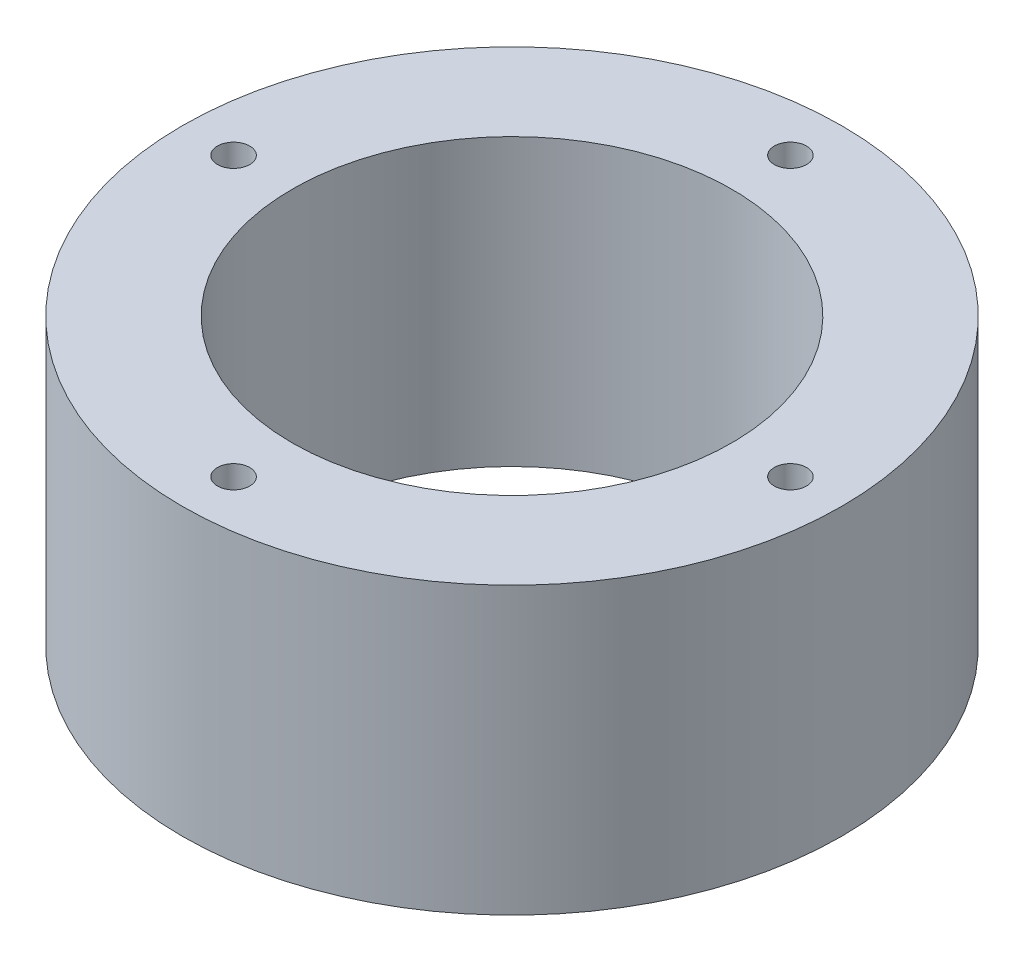
ISO-10303-21;
HEADER;
FILE_DESCRIPTION(('STEP AP214'),'2;1');
FILE_NAME('part.step','',(''),(''),'','','');
FILE_SCHEMA(('AUTOMOTIVE_DESIGN { 1 0 10303 214 1 1 1 1 }'));
ENDSEC;
DATA;
#1=APPLICATION_CONTEXT('core data for automotive mechanical design processes');
#2=APPLICATION_PROTOCOL_DEFINITION('international standard','automotive_design',2000,#1);
#3=PRODUCT_CONTEXT('',#1,'mechanical');
#4=PRODUCT('Part','Part','',(#3));
#5=PRODUCT_RELATED_PRODUCT_CATEGORY('part','',(#4));
#6=PRODUCT_DEFINITION_FORMATION('','',#4);
#7=PRODUCT_DEFINITION_CONTEXT('part definition',#1,'design');
#8=PRODUCT_DEFINITION('design','',#6,#7);
#9=PRODUCT_DEFINITION_SHAPE('','',#8);
#10=(LENGTH_UNIT() NAMED_UNIT(*) SI_UNIT(.MILLI.,.METRE.));
#11=(NAMED_UNIT(*) PLANE_ANGLE_UNIT() SI_UNIT($,.RADIAN.));
#12=(NAMED_UNIT(*) SI_UNIT($,.STERADIAN.) SOLID_ANGLE_UNIT());
#13=UNCERTAINTY_MEASURE_WITH_UNIT(LENGTH_MEASURE(1.E-05),#10,'distance_accuracy_value','');
#14=(GEOMETRIC_REPRESENTATION_CONTEXT(3) GLOBAL_UNCERTAINTY_ASSIGNED_CONTEXT((#13)) GLOBAL_UNIT_ASSIGNED_CONTEXT((#10,
#11,#12)) REPRESENTATION_CONTEXT('',''));
#15=CARTESIAN_POINT('',(0.,0.,0.));
#16=DIRECTION('',(0.,0.,1.));
#17=DIRECTION('',(1.,0.,0.));
#18=AXIS2_PLACEMENT_3D('',#15,#16,#17);
#19=CARTESIAN_POINT('',(0.,19.5,0.));
#20=DIRECTION('',(0.,1.,0.));
#21=DIRECTION('',(0.,0.,1.));
#22=AXIS2_PLACEMENT_3D('',#19,#20,#21);
#23=PLANE('',#22);
#24=CARTESIAN_POINT('',(0.,19.5,19.));
#25=DIRECTION('',(0.,1.,0.));
#26=DIRECTION('',(0.,0.,1.));
#27=AXIS2_PLACEMENT_3D('',#24,#25,#26);
#28=CIRCLE('',#27,1.1);
#29=CARTESIAN_POINT('',(0.,19.5,20.1));
#30=VERTEX_POINT('',#29);
#31=EDGE_CURVE('E74',#30,#30,#28,.T.);
#32=ORIENTED_EDGE('',*,*,#31,.F.);
#33=EDGE_LOOP('',(#32));
#34=FACE_BOUND('',#33,.T.);
#35=CARTESIAN_POINT('',(0.,19.5,-19.));
#36=DIRECTION('',(0.,1.,0.));
#37=DIRECTION('',(0.,0.,1.));
#38=AXIS2_PLACEMENT_3D('',#35,#36,#37);
#39=CIRCLE('',#38,1.1);
#40=CARTESIAN_POINT('',(0.,19.5,-17.9));
#41=VERTEX_POINT('',#40);
#42=EDGE_CURVE('E59',#41,#41,#39,.T.);
#43=ORIENTED_EDGE('',*,*,#42,.F.);
#44=EDGE_LOOP('',(#43));
#45=FACE_BOUND('',#44,.T.);
#46=CARTESIAN_POINT('',(0.,19.5,0.));
#47=DIRECTION('',(0.,1.,0.));
#48=DIRECTION('',(0.,0.,1.));
#49=AXIS2_PLACEMENT_3D('',#46,#47,#48);
#50=CIRCLE('',#49,22.5);
#51=CARTESIAN_POINT('',(0.,19.5,22.5));
#52=VERTEX_POINT('',#51);
#53=EDGE_CURVE('E10',#52,#52,#50,.T.);
#54=ORIENTED_EDGE('',*,*,#53,.T.);
#55=EDGE_LOOP('',(#54));
#56=FACE_BOUND('',#55,.T.);
#57=CARTESIAN_POINT('',(0.,19.5,0.));
#58=DIRECTION('',(0.,1.,0.));
#59=DIRECTION('',(0.,0.,1.));
#60=AXIS2_PLACEMENT_3D('',#57,#58,#59);
#61=CIRCLE('',#60,15.);
#62=CARTESIAN_POINT('',(0.,19.5,15.));
#63=VERTEX_POINT('',#62);
#64=EDGE_CURVE('E53',#63,#63,#61,.T.);
#65=ORIENTED_EDGE('',*,*,#64,.F.);
#66=EDGE_LOOP('',(#65));
#67=FACE_BOUND('',#66,.T.);
#68=CARTESIAN_POINT('',(19.,19.5,0.));
#69=DIRECTION('',(0.,1.,0.));
#70=DIRECTION('',(0.,0.,1.));
#71=AXIS2_PLACEMENT_3D('',#68,#69,#70);
#72=CIRCLE('',#71,1.1);
#73=CARTESIAN_POINT('',(19.,19.5,1.1));
#74=VERTEX_POINT('',#73);
#75=EDGE_CURVE('E66',#74,#74,#72,.T.);
#76=ORIENTED_EDGE('',*,*,#75,.F.);
#77=EDGE_LOOP('',(#76));
#78=FACE_BOUND('',#77,.T.);
#79=CARTESIAN_POINT('',(-19.,19.5,0.));
#80=DIRECTION('',(0.,1.,0.));
#81=DIRECTION('',(0.,0.,1.));
#82=AXIS2_PLACEMENT_3D('',#79,#80,#81);
#83=CIRCLE('',#82,1.10000000000001);
#84=CARTESIAN_POINT('',(-19.,19.5,1.10000000000001));
#85=VERTEX_POINT('',#84);
#86=EDGE_CURVE('E82',#85,#85,#83,.T.);
#87=ORIENTED_EDGE('',*,*,#86,.F.);
#88=EDGE_LOOP('',(#87));
#89=FACE_BOUND('',#88,.T.);
#90=ADVANCED_FACE('F38',(#34,#45,#56,#67,#78,#89),#23,.T.);
#91=CARTESIAN_POINT('',(0.,0.,0.));
#92=DIRECTION('',(0.,1.,0.));
#93=DIRECTION('',(0.,0.,1.));
#94=AXIS2_PLACEMENT_3D('',#91,#92,#93);
#95=PLANE('',#94);
#96=CARTESIAN_POINT('',(0.,0.,0.));
#97=DIRECTION('',(0.,1.,0.));
#98=DIRECTION('',(0.,0.,1.));
#99=AXIS2_PLACEMENT_3D('',#96,#97,#98);
#100=CIRCLE('',#99,22.5);
#101=CARTESIAN_POINT('',(0.,0.,22.5));
#102=VERTEX_POINT('',#101);
#103=EDGE_CURVE('E42',#102,#102,#100,.T.);
#104=ORIENTED_EDGE('',*,*,#103,.F.);
#105=EDGE_LOOP('',(#104));
#106=FACE_BOUND('',#105,.T.);
#107=CARTESIAN_POINT('',(0.,0.,0.));
#108=DIRECTION('',(0.,1.,0.));
#109=DIRECTION('',(0.,0.,1.));
#110=AXIS2_PLACEMENT_3D('',#107,#108,#109);
#111=CIRCLE('',#110,15.);
#112=CARTESIAN_POINT('',(0.,0.,15.));
#113=VERTEX_POINT('',#112);
#114=EDGE_CURVE('E55',#113,#113,#111,.T.);
#115=ORIENTED_EDGE('',*,*,#114,.T.);
#116=EDGE_LOOP('',(#115));
#117=FACE_BOUND('',#116,.T.);
#118=CARTESIAN_POINT('',(0.,0.,-19.));
#119=DIRECTION('',(0.,1.,0.));
#120=DIRECTION('',(0.,0.,1.));
#121=AXIS2_PLACEMENT_3D('',#118,#119,#120);
#122=CIRCLE('',#121,1.1);
#123=CARTESIAN_POINT('',(0.,0.,-17.9));
#124=VERTEX_POINT('',#123);
#125=EDGE_CURVE('E63',#124,#124,#122,.T.);
#126=ORIENTED_EDGE('',*,*,#125,.T.);
#127=EDGE_LOOP('',(#126));
#128=FACE_BOUND('',#127,.T.);
#129=CARTESIAN_POINT('',(19.,0.,0.));
#130=DIRECTION('',(0.,1.,0.));
#131=DIRECTION('',(0.,0.,1.));
#132=AXIS2_PLACEMENT_3D('',#129,#130,#131);
#133=CIRCLE('',#132,1.1);
#134=CARTESIAN_POINT('',(19.,0.,1.1));
#135=VERTEX_POINT('',#134);
#136=EDGE_CURVE('E70',#135,#135,#133,.T.);
#137=ORIENTED_EDGE('',*,*,#136,.T.);
#138=EDGE_LOOP('',(#137));
#139=FACE_BOUND('',#138,.T.);
#140=CARTESIAN_POINT('',(0.,0.,19.));
#141=DIRECTION('',(0.,1.,0.));
#142=DIRECTION('',(0.,0.,1.));
#143=AXIS2_PLACEMENT_3D('',#140,#141,#142);
#144=CIRCLE('',#143,1.1);
#145=CARTESIAN_POINT('',(0.,0.,20.1));
#146=VERTEX_POINT('',#145);
#147=EDGE_CURVE('E78',#146,#146,#144,.T.);
#148=ORIENTED_EDGE('',*,*,#147,.T.);
#149=EDGE_LOOP('',(#148));
#150=FACE_BOUND('',#149,.T.);
#151=CARTESIAN_POINT('',(-19.,0.,0.));
#152=DIRECTION('',(0.,1.,0.));
#153=DIRECTION('',(0.,0.,1.));
#154=AXIS2_PLACEMENT_3D('',#151,#152,#153);
#155=CIRCLE('',#154,1.10000000000001);
#156=CARTESIAN_POINT('',(-19.,0.,1.10000000000001));
#157=VERTEX_POINT('',#156);
#158=EDGE_CURVE('E86',#157,#157,#155,.T.);
#159=ORIENTED_EDGE('',*,*,#158,.T.);
#160=EDGE_LOOP('',(#159));
#161=FACE_BOUND('',#160,.T.);
#162=ADVANCED_FACE('F97',(#106,#117,#128,#139,#150,#161),#95,.F.);
#163=CARTESIAN_POINT('',(0.,19.5,0.));
#164=DIRECTION('',(0.,-1.,0.));
#165=DIRECTION('',(0.,0.,-1.));
#166=AXIS2_PLACEMENT_3D('',#163,#164,#165);
#167=CYLINDRICAL_SURFACE('',#166,22.5);
#168=ORIENTED_EDGE('',*,*,#53,.F.);
#169=EDGE_LOOP('',(#168));
#170=FACE_BOUND('',#169,.T.);
#171=ORIENTED_EDGE('',*,*,#103,.T.);
#172=EDGE_LOOP('',(#171));
#173=FACE_BOUND('',#172,.T.);
#174=ADVANCED_FACE('F40',(#170,#173),#167,.T.);
#175=CARTESIAN_POINT('',(0.,19.5,0.));
#176=DIRECTION('',(0.,-1.,0.));
#177=DIRECTION('',(0.,0.,-1.));
#178=AXIS2_PLACEMENT_3D('',#175,#176,#177);
#179=CYLINDRICAL_SURFACE('',#178,15.);
#180=ORIENTED_EDGE('',*,*,#64,.T.);
#181=EDGE_LOOP('',(#180));
#182=FACE_BOUND('',#181,.T.);
#183=ORIENTED_EDGE('',*,*,#114,.F.);
#184=EDGE_LOOP('',(#183));
#185=FACE_BOUND('',#184,.T.);
#186=ADVANCED_FACE('F107',(#182,#185),#179,.F.);
#187=CARTESIAN_POINT('',(0.,19.5,-19.));
#188=DIRECTION('',(0.,-1.,0.));
#189=DIRECTION('',(0.,0.,-1.));
#190=AXIS2_PLACEMENT_3D('',#187,#188,#189);
#191=CYLINDRICAL_SURFACE('',#190,1.1);
#192=ORIENTED_EDGE('',*,*,#42,.T.);
#193=EDGE_LOOP('',(#192));
#194=FACE_BOUND('',#193,.T.);
#195=ORIENTED_EDGE('',*,*,#125,.F.);
#196=EDGE_LOOP('',(#195));
#197=FACE_BOUND('',#196,.T.);
#198=ADVANCED_FACE('F110',(#194,#197),#191,.F.);
#199=CARTESIAN_POINT('',(19.,19.5,0.));
#200=DIRECTION('',(0.,-1.,0.));
#201=DIRECTION('',(0.,0.,-1.));
#202=AXIS2_PLACEMENT_3D('',#199,#200,#201);
#203=CYLINDRICAL_SURFACE('',#202,1.1);
#204=ORIENTED_EDGE('',*,*,#75,.T.);
#205=EDGE_LOOP('',(#204));
#206=FACE_BOUND('',#205,.T.);
#207=ORIENTED_EDGE('',*,*,#136,.F.);
#208=EDGE_LOOP('',(#207));
#209=FACE_BOUND('',#208,.T.);
#210=ADVANCED_FACE('F114',(#206,#209),#203,.F.);
#211=CARTESIAN_POINT('',(0.,19.5,19.));
#212=DIRECTION('',(0.,-1.,0.));
#213=DIRECTION('',(0.,0.,-1.));
#214=AXIS2_PLACEMENT_3D('',#211,#212,#213);
#215=CYLINDRICAL_SURFACE('',#214,1.1);
#216=ORIENTED_EDGE('',*,*,#31,.T.);
#217=EDGE_LOOP('',(#216));
#218=FACE_BOUND('',#217,.T.);
#219=ORIENTED_EDGE('',*,*,#147,.F.);
#220=EDGE_LOOP('',(#219));
#221=FACE_BOUND('',#220,.T.);
#222=ADVANCED_FACE('F118',(#218,#221),#215,.F.);
#223=CARTESIAN_POINT('',(-19.,19.5,0.));
#224=DIRECTION('',(0.,-1.,0.));
#225=DIRECTION('',(0.,0.,-1.));
#226=AXIS2_PLACEMENT_3D('',#223,#224,#225);
#227=CYLINDRICAL_SURFACE('',#226,1.10000000000001);
#228=ORIENTED_EDGE('',*,*,#86,.T.);
#229=EDGE_LOOP('',(#228));
#230=FACE_BOUND('',#229,.T.);
#231=ORIENTED_EDGE('',*,*,#158,.F.);
#232=EDGE_LOOP('',(#231));
#233=FACE_BOUND('',#232,.T.);
#234=ADVANCED_FACE('F93',(#230,#233),#227,.F.);
#235=CLOSED_SHELL('',(#90,#162,#174,#186,#198,#210,#222,#234));
#236=MANIFOLD_SOLID_BREP('B2',#235);
#237=ADVANCED_BREP_SHAPE_REPRESENTATION('',(#18,#236),#14);
#238=SHAPE_DEFINITION_REPRESENTATION(#9,#237);
ENDSEC;
END-ISO-10303-21;
